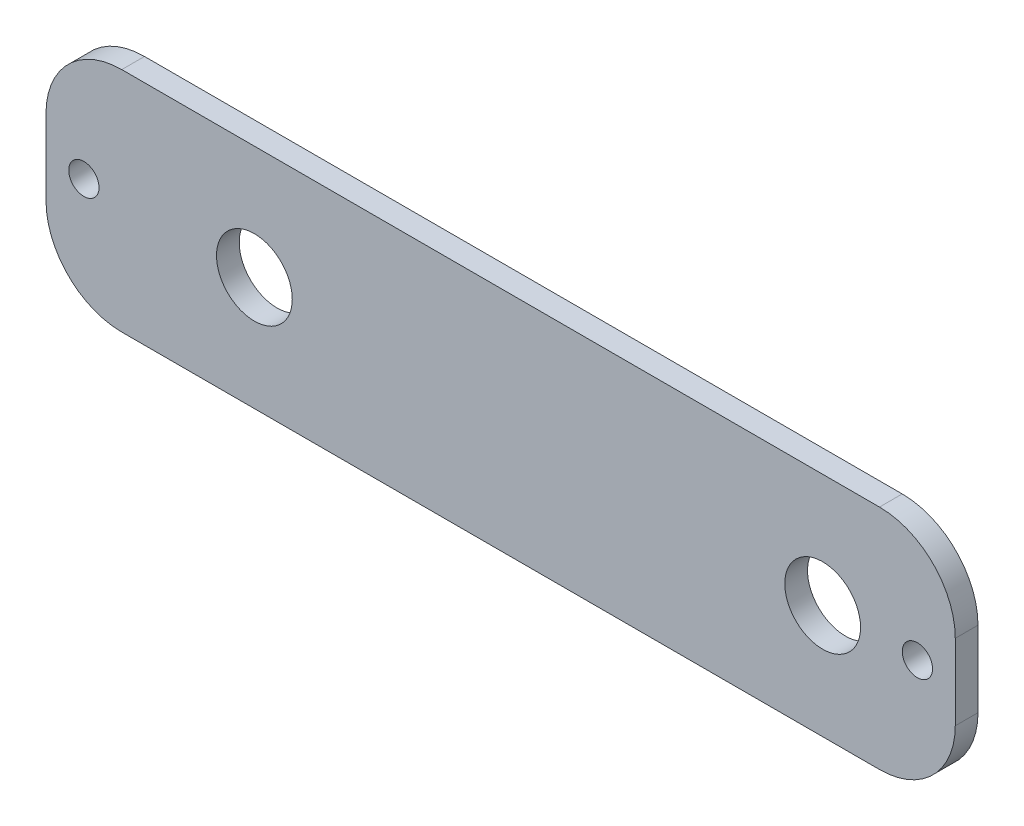
ISO-10303-21;
HEADER;
FILE_DESCRIPTION(('STEP AP214'),'2;1');
FILE_NAME('part.step','',(''),(''),'','','');
FILE_SCHEMA(('AUTOMOTIVE_DESIGN { 1 0 10303 214 1 1 1 1 }'));
ENDSEC;
DATA;
#1=APPLICATION_CONTEXT('core data for automotive mechanical design processes');
#2=APPLICATION_PROTOCOL_DEFINITION('international standard','automotive_design',2000,#1);
#3=PRODUCT_CONTEXT('',#1,'mechanical');
#4=PRODUCT('Part','Part','',(#3));
#5=PRODUCT_RELATED_PRODUCT_CATEGORY('part','',(#4));
#6=PRODUCT_DEFINITION_FORMATION('','',#4);
#7=PRODUCT_DEFINITION_CONTEXT('part definition',#1,'design');
#8=PRODUCT_DEFINITION('design','',#6,#7);
#9=PRODUCT_DEFINITION_SHAPE('','',#8);
#10=(LENGTH_UNIT() NAMED_UNIT(*) SI_UNIT(.MILLI.,.METRE.));
#11=(NAMED_UNIT(*) PLANE_ANGLE_UNIT() SI_UNIT($,.RADIAN.));
#12=(NAMED_UNIT(*) SI_UNIT($,.STERADIAN.) SOLID_ANGLE_UNIT());
#13=UNCERTAINTY_MEASURE_WITH_UNIT(LENGTH_MEASURE(1.E-05),#10,'distance_accuracy_value','');
#14=(GEOMETRIC_REPRESENTATION_CONTEXT(3) GLOBAL_UNCERTAINTY_ASSIGNED_CONTEXT((#13)) GLOBAL_UNIT_ASSIGNED_CONTEXT((#10,
#11,#12)) REPRESENTATION_CONTEXT('',''));
#15=CARTESIAN_POINT('',(0.,0.,0.));
#16=DIRECTION('',(0.,0.,1.));
#17=DIRECTION('',(1.,0.,0.));
#18=AXIS2_PLACEMENT_3D('',#15,#16,#17);
#19=CARTESIAN_POINT('',(0.,0.,3.));
#20=DIRECTION('',(0.,0.,1.));
#21=DIRECTION('',(1.,0.,0.));
#22=AXIS2_PLACEMENT_3D('',#19,#20,#21);
#23=PLANE('',#22);
#24=CARTESIAN_POINT('',(27.5,-15.,3.));
#25=DIRECTION('',(0.,0.,1.));
#26=DIRECTION('',(1.,0.,0.));
#27=AXIS2_PLACEMENT_3D('',#24,#25,#26);
#28=CIRCLE('',#27,5.);
#29=CARTESIAN_POINT('',(32.5,-15.,3.));
#30=VERTEX_POINT('',#29);
#31=EDGE_CURVE('E200',#30,#30,#28,.T.);
#32=ORIENTED_EDGE('',*,*,#31,.F.);
#33=EDGE_LOOP('',(#32));
#34=FACE_BOUND('',#33,.T.);
#35=CARTESIAN_POINT('',(102.5,-15.,3.));
#36=DIRECTION('',(0.,0.,1.));
#37=DIRECTION('',(1.,0.,0.));
#38=AXIS2_PLACEMENT_3D('',#35,#36,#37);
#39=CIRCLE('',#38,5.);
#40=CARTESIAN_POINT('',(107.5,-15.,3.));
#41=VERTEX_POINT('',#40);
#42=EDGE_CURVE('E194',#41,#41,#39,.T.);
#43=ORIENTED_EDGE('',*,*,#42,.F.);
#44=EDGE_LOOP('',(#43));
#45=FACE_BOUND('',#44,.T.);
#46=CARTESIAN_POINT('',(115.,-15.,3.));
#47=DIRECTION('',(0.,0.,1.));
#48=DIRECTION('',(1.,0.,0.));
#49=AXIS2_PLACEMENT_3D('',#46,#47,#48);
#50=CIRCLE('',#49,2.);
#51=CARTESIAN_POINT('',(117.,-15.,3.));
#52=VERTEX_POINT('',#51);
#53=EDGE_CURVE('E134',#52,#52,#50,.T.);
#54=ORIENTED_EDGE('',*,*,#53,.F.);
#55=EDGE_LOOP('',(#54));
#56=FACE_BOUND('',#55,.T.);
#57=DIRECTION('',(0.,-1.,0.));
#58=VECTOR('',#57,1.);
#59=CARTESIAN_POINT('',(0.,0.,3.));
#60=LINE('',#59,#58);
#61=CARTESIAN_POINT('',(0.,-10.,3.));
#62=VERTEX_POINT('',#61);
#63=CARTESIAN_POINT('',(0.,-20.,3.));
#64=VERTEX_POINT('',#63);
#65=EDGE_CURVE('E139',#62,#64,#60,.T.);
#66=ORIENTED_EDGE('',*,*,#65,.T.);
#67=CARTESIAN_POINT('',(10.,-20.,3.));
#68=DIRECTION('',(0.,0.,1.));
#69=DIRECTION('',(1.,0.,0.));
#70=AXIS2_PLACEMENT_3D('',#67,#68,#69);
#71=CIRCLE('',#70,10.);
#72=CARTESIAN_POINT('',(10.,-30.,3.));
#73=VERTEX_POINT('',#72);
#74=EDGE_CURVE('E153',#64,#73,#71,.T.);
#75=ORIENTED_EDGE('',*,*,#74,.T.);
#76=DIRECTION('',(1.,0.,0.));
#77=VECTOR('',#76,1.);
#78=CARTESIAN_POINT('',(0.,-30.,3.));
#79=LINE('',#78,#77);
#80=CARTESIAN_POINT('',(110.,-30.,3.));
#81=VERTEX_POINT('',#80);
#82=EDGE_CURVE('E120',#73,#81,#79,.T.);
#83=ORIENTED_EDGE('',*,*,#82,.T.);
#84=CARTESIAN_POINT('',(110.,-20.,3.));
#85=DIRECTION('',(0.,0.,1.));
#86=DIRECTION('',(1.,0.,0.));
#87=AXIS2_PLACEMENT_3D('',#84,#85,#86);
#88=CIRCLE('',#87,10.);
#89=CARTESIAN_POINT('',(120.,-20.,3.));
#90=VERTEX_POINT('',#89);
#91=EDGE_CURVE('E149',#81,#90,#88,.T.);
#92=ORIENTED_EDGE('',*,*,#91,.T.);
#93=DIRECTION('',(0.,1.,0.));
#94=VECTOR('',#93,1.);
#95=CARTESIAN_POINT('',(120.,0.,3.));
#96=LINE('',#95,#94);
#97=CARTESIAN_POINT('',(120.,-10.,3.));
#98=VERTEX_POINT('',#97);
#99=EDGE_CURVE('E162',#90,#98,#96,.T.);
#100=ORIENTED_EDGE('',*,*,#99,.T.);
#101=CARTESIAN_POINT('',(110.,-10.,3.));
#102=DIRECTION('',(0.,0.,1.));
#103=DIRECTION('',(1.,0.,0.));
#104=AXIS2_PLACEMENT_3D('',#101,#102,#103);
#105=CIRCLE('',#104,10.);
#106=CARTESIAN_POINT('',(110.,0.,3.));
#107=VERTEX_POINT('',#106);
#108=EDGE_CURVE('E55',#98,#107,#105,.T.);
#109=ORIENTED_EDGE('',*,*,#108,.T.);
#110=DIRECTION('',(-1.,0.,0.));
#111=VECTOR('',#110,1.);
#112=CARTESIAN_POINT('',(0.,0.,3.));
#113=LINE('',#112,#111);
#114=CARTESIAN_POINT('',(10.,0.,3.));
#115=VERTEX_POINT('',#114);
#116=EDGE_CURVE('E140',#107,#115,#113,.T.);
#117=ORIENTED_EDGE('',*,*,#116,.T.);
#118=CARTESIAN_POINT('',(10.,-10.,3.));
#119=DIRECTION('',(0.,0.,1.));
#120=DIRECTION('',(1.,0.,0.));
#121=AXIS2_PLACEMENT_3D('',#118,#119,#120);
#122=CIRCLE('',#121,10.);
#123=EDGE_CURVE('E151',#115,#62,#122,.T.);
#124=ORIENTED_EDGE('',*,*,#123,.T.);
#125=EDGE_LOOP('',(#66,#75,#83,#92,#100,#109,#117,#124));
#126=FACE_BOUND('',#125,.T.);
#127=CARTESIAN_POINT('',(4.99999999999999,-15.,3.));
#128=DIRECTION('',(0.,0.,1.));
#129=DIRECTION('',(1.,0.,0.));
#130=AXIS2_PLACEMENT_3D('',#127,#128,#129);
#131=CIRCLE('',#130,2.);
#132=CARTESIAN_POINT('',(6.99999999999999,-15.,3.));
#133=VERTEX_POINT('',#132);
#134=EDGE_CURVE('E185',#133,#133,#131,.T.);
#135=ORIENTED_EDGE('',*,*,#134,.F.);
#136=EDGE_LOOP('',(#135));
#137=FACE_BOUND('',#136,.T.);
#138=ADVANCED_FACE('F33',(#34,#45,#56,#126,#137),#23,.T.);
#139=CARTESIAN_POINT('',(0.,0.,0.));
#140=DIRECTION('',(0.,0.,1.));
#141=DIRECTION('',(1.,0.,0.));
#142=AXIS2_PLACEMENT_3D('',#139,#140,#141);
#143=PLANE('',#142);
#144=CARTESIAN_POINT('',(27.5,-15.,0.));
#145=DIRECTION('',(0.,0.,1.));
#146=DIRECTION('',(1.,0.,0.));
#147=AXIS2_PLACEMENT_3D('',#144,#145,#146);
#148=CIRCLE('',#147,5.);
#149=CARTESIAN_POINT('',(32.5,-15.,0.));
#150=VERTEX_POINT('',#149);
#151=EDGE_CURVE('E191',#150,#150,#148,.T.);
#152=ORIENTED_EDGE('',*,*,#151,.T.);
#153=EDGE_LOOP('',(#152));
#154=FACE_BOUND('',#153,.T.);
#155=CARTESIAN_POINT('',(102.5,-15.,0.));
#156=DIRECTION('',(0.,0.,1.));
#157=DIRECTION('',(1.,0.,0.));
#158=AXIS2_PLACEMENT_3D('',#155,#156,#157);
#159=CIRCLE('',#158,5.);
#160=CARTESIAN_POINT('',(107.5,-15.,0.));
#161=VERTEX_POINT('',#160);
#162=EDGE_CURVE('E197',#161,#161,#159,.T.);
#163=ORIENTED_EDGE('',*,*,#162,.T.);
#164=EDGE_LOOP('',(#163));
#165=FACE_BOUND('',#164,.T.);
#166=DIRECTION('',(1.,0.,0.));
#167=VECTOR('',#166,1.);
#168=CARTESIAN_POINT('',(0.,-30.,0.));
#169=LINE('',#168,#167);
#170=CARTESIAN_POINT('',(10.,-30.,0.));
#171=VERTEX_POINT('',#170);
#172=CARTESIAN_POINT('',(110.,-30.,0.));
#173=VERTEX_POINT('',#172);
#174=EDGE_CURVE('E117',#171,#173,#169,.T.);
#175=ORIENTED_EDGE('',*,*,#174,.F.);
#176=CARTESIAN_POINT('',(10.,-20.,0.));
#177=DIRECTION('',(0.,0.,1.));
#178=DIRECTION('',(1.,0.,0.));
#179=AXIS2_PLACEMENT_3D('',#176,#177,#178);
#180=CIRCLE('',#179,10.);
#181=CARTESIAN_POINT('',(0.,-20.,0.));
#182=VERTEX_POINT('',#181);
#183=EDGE_CURVE('E100',#171,#182,#180,.F.);
#184=ORIENTED_EDGE('',*,*,#183,.T.);
#185=DIRECTION('',(0.,-1.,0.));
#186=VECTOR('',#185,1.);
#187=CARTESIAN_POINT('',(0.,0.,0.));
#188=LINE('',#187,#186);
#189=CARTESIAN_POINT('',(0.,-10.,0.));
#190=VERTEX_POINT('',#189);
#191=EDGE_CURVE('E129',#190,#182,#188,.T.);
#192=ORIENTED_EDGE('',*,*,#191,.F.);
#193=CARTESIAN_POINT('',(10.,-10.,0.));
#194=DIRECTION('',(0.,0.,1.));
#195=DIRECTION('',(1.,0.,0.));
#196=AXIS2_PLACEMENT_3D('',#193,#194,#195);
#197=CIRCLE('',#196,10.);
#198=CARTESIAN_POINT('',(10.,0.,0.));
#199=VERTEX_POINT('',#198);
#200=EDGE_CURVE('E111',#190,#199,#197,.F.);
#201=ORIENTED_EDGE('',*,*,#200,.T.);
#202=DIRECTION('',(-1.,0.,0.));
#203=VECTOR('',#202,1.);
#204=CARTESIAN_POINT('',(0.,0.,0.));
#205=LINE('',#204,#203);
#206=CARTESIAN_POINT('',(110.,0.,0.));
#207=VERTEX_POINT('',#206);
#208=EDGE_CURVE('E132',#207,#199,#205,.T.);
#209=ORIENTED_EDGE('',*,*,#208,.F.);
#210=CARTESIAN_POINT('',(110.,-10.,0.));
#211=DIRECTION('',(0.,0.,1.));
#212=DIRECTION('',(1.,0.,0.));
#213=AXIS2_PLACEMENT_3D('',#210,#211,#212);
#214=CIRCLE('',#213,10.);
#215=CARTESIAN_POINT('',(120.,-10.,0.));
#216=VERTEX_POINT('',#215);
#217=EDGE_CURVE('E121',#207,#216,#214,.F.);
#218=ORIENTED_EDGE('',*,*,#217,.T.);
#219=DIRECTION('',(0.,1.,0.));
#220=VECTOR('',#219,1.);
#221=CARTESIAN_POINT('',(120.,0.,0.));
#222=LINE('',#221,#220);
#223=CARTESIAN_POINT('',(120.,-20.,0.));
#224=VERTEX_POINT('',#223);
#225=EDGE_CURVE('E128',#224,#216,#222,.T.);
#226=ORIENTED_EDGE('',*,*,#225,.F.);
#227=CARTESIAN_POINT('',(110.,-20.,0.));
#228=DIRECTION('',(0.,0.,1.));
#229=DIRECTION('',(1.,0.,0.));
#230=AXIS2_PLACEMENT_3D('',#227,#228,#229);
#231=CIRCLE('',#230,10.);
#232=EDGE_CURVE('E127',#224,#173,#231,.F.);
#233=ORIENTED_EDGE('',*,*,#232,.T.);
#234=EDGE_LOOP('',(#175,#184,#192,#201,#209,#218,#226,#233));
#235=FACE_BOUND('',#234,.T.);
#236=CARTESIAN_POINT('',(115.,-15.,0.));
#237=DIRECTION('',(0.,0.,1.));
#238=DIRECTION('',(1.,0.,0.));
#239=AXIS2_PLACEMENT_3D('',#236,#237,#238);
#240=CIRCLE('',#239,2.);
#241=CARTESIAN_POINT('',(117.,-15.,0.));
#242=VERTEX_POINT('',#241);
#243=EDGE_CURVE('E182',#242,#242,#240,.T.);
#244=ORIENTED_EDGE('',*,*,#243,.T.);
#245=EDGE_LOOP('',(#244));
#246=FACE_BOUND('',#245,.T.);
#247=CARTESIAN_POINT('',(4.99999999999999,-15.,0.));
#248=DIRECTION('',(0.,0.,1.));
#249=DIRECTION('',(1.,0.,0.));
#250=AXIS2_PLACEMENT_3D('',#247,#248,#249);
#251=CIRCLE('',#250,2.);
#252=CARTESIAN_POINT('',(6.99999999999999,-15.,0.));
#253=VERTEX_POINT('',#252);
#254=EDGE_CURVE('E188',#253,#253,#251,.T.);
#255=ORIENTED_EDGE('',*,*,#254,.T.);
#256=EDGE_LOOP('',(#255));
#257=FACE_BOUND('',#256,.T.);
#258=ADVANCED_FACE('F124',(#154,#165,#235,#246,#257),#143,.F.);
#259=CARTESIAN_POINT('',(0.,0.,3.));
#260=DIRECTION('',(1.,0.,0.));
#261=DIRECTION('',(0.,1.,0.));
#262=AXIS2_PLACEMENT_3D('',#259,#260,#261);
#263=PLANE('',#262);
#264=ORIENTED_EDGE('',*,*,#191,.T.);
#265=DIRECTION('',(0.,0.,-1.));
#266=VECTOR('',#265,1.);
#267=CARTESIAN_POINT('',(0.,-20.,3.));
#268=LINE('',#267,#266);
#269=EDGE_CURVE('E105',#182,#64,#268,.F.);
#270=ORIENTED_EDGE('',*,*,#269,.T.);
#271=ORIENTED_EDGE('',*,*,#65,.F.);
#272=DIRECTION('',(0.,0.,-1.));
#273=VECTOR('',#272,1.);
#274=CARTESIAN_POINT('',(0.,-10.,3.));
#275=LINE('',#274,#273);
#276=EDGE_CURVE('E110',#62,#190,#275,.T.);
#277=ORIENTED_EDGE('',*,*,#276,.T.);
#278=EDGE_LOOP('',(#264,#270,#271,#277));
#279=FACE_BOUND('',#278,.T.);
#280=ADVANCED_FACE('F178',(#279),#263,.F.);
#281=CARTESIAN_POINT('',(0.,-30.,3.));
#282=DIRECTION('',(0.,1.,0.));
#283=DIRECTION('',(0.,0.,1.));
#284=AXIS2_PLACEMENT_3D('',#281,#282,#283);
#285=PLANE('',#284);
#286=ORIENTED_EDGE('',*,*,#82,.F.);
#287=DIRECTION('',(0.,0.,-1.));
#288=VECTOR('',#287,1.);
#289=CARTESIAN_POINT('',(10.,-30.,3.));
#290=LINE('',#289,#288);
#291=EDGE_CURVE('E104',#73,#171,#290,.T.);
#292=ORIENTED_EDGE('',*,*,#291,.T.);
#293=ORIENTED_EDGE('',*,*,#174,.T.);
#294=DIRECTION('',(0.,0.,-1.));
#295=VECTOR('',#294,1.);
#296=CARTESIAN_POINT('',(110.,-30.,3.));
#297=LINE('',#296,#295);
#298=EDGE_CURVE('E122',#173,#81,#297,.F.);
#299=ORIENTED_EDGE('',*,*,#298,.T.);
#300=EDGE_LOOP('',(#286,#292,#293,#299));
#301=FACE_BOUND('',#300,.T.);
#302=ADVANCED_FACE('F116',(#301),#285,.F.);
#303=CARTESIAN_POINT('',(120.,0.,3.));
#304=DIRECTION('',(-1.,0.,0.));
#305=DIRECTION('',(0.,0.,1.));
#306=AXIS2_PLACEMENT_3D('',#303,#304,#305);
#307=PLANE('',#306);
#308=ORIENTED_EDGE('',*,*,#99,.F.);
#309=DIRECTION('',(0.,0.,-1.));
#310=VECTOR('',#309,1.);
#311=CARTESIAN_POINT('',(120.,-20.,3.));
#312=LINE('',#311,#310);
#313=EDGE_CURVE('E11',#90,#224,#312,.T.);
#314=ORIENTED_EDGE('',*,*,#313,.T.);
#315=ORIENTED_EDGE('',*,*,#225,.T.);
#316=DIRECTION('',(0.,0.,-1.));
#317=VECTOR('',#316,1.);
#318=CARTESIAN_POINT('',(120.,-10.,3.));
#319=LINE('',#318,#317);
#320=EDGE_CURVE('E41',#216,#98,#319,.F.);
#321=ORIENTED_EDGE('',*,*,#320,.T.);
#322=EDGE_LOOP('',(#308,#314,#315,#321));
#323=FACE_BOUND('',#322,.T.);
#324=ADVANCED_FACE('F161',(#323),#307,.F.);
#325=CARTESIAN_POINT('',(0.,0.,3.));
#326=DIRECTION('',(0.,-1.,0.));
#327=DIRECTION('',(0.,0.,-1.));
#328=AXIS2_PLACEMENT_3D('',#325,#326,#327);
#329=PLANE('',#328);
#330=ORIENTED_EDGE('',*,*,#208,.T.);
#331=DIRECTION('',(0.,0.,-1.));
#332=VECTOR('',#331,1.);
#333=CARTESIAN_POINT('',(10.,0.,3.));
#334=LINE('',#333,#332);
#335=EDGE_CURVE('E48',#199,#115,#334,.F.);
#336=ORIENTED_EDGE('',*,*,#335,.T.);
#337=ORIENTED_EDGE('',*,*,#116,.F.);
#338=DIRECTION('',(0.,0.,-1.));
#339=VECTOR('',#338,1.);
#340=CARTESIAN_POINT('',(110.,0.,3.));
#341=LINE('',#340,#339);
#342=EDGE_CURVE('E155',#107,#207,#341,.T.);
#343=ORIENTED_EDGE('',*,*,#342,.T.);
#344=EDGE_LOOP('',(#330,#336,#337,#343));
#345=FACE_BOUND('',#344,.T.);
#346=ADVANCED_FACE('F171',(#345),#329,.F.);
#347=CARTESIAN_POINT('',(115.,-15.,3.));
#348=DIRECTION('',(0.,0.,-1.));
#349=DIRECTION('',(-1.,0.,0.));
#350=AXIS2_PLACEMENT_3D('',#347,#348,#349);
#351=CYLINDRICAL_SURFACE('',#350,2.);
#352=ORIENTED_EDGE('',*,*,#53,.T.);
#353=EDGE_LOOP('',(#352));
#354=FACE_BOUND('',#353,.T.);
#355=ORIENTED_EDGE('',*,*,#243,.F.);
#356=EDGE_LOOP('',(#355));
#357=FACE_BOUND('',#356,.T.);
#358=ADVANCED_FACE('F222',(#354,#357),#351,.F.);
#359=CARTESIAN_POINT('',(4.99999999999999,-15.,3.));
#360=DIRECTION('',(0.,0.,-1.));
#361=DIRECTION('',(-1.,0.,0.));
#362=AXIS2_PLACEMENT_3D('',#359,#360,#361);
#363=CYLINDRICAL_SURFACE('',#362,2.);
#364=ORIENTED_EDGE('',*,*,#134,.T.);
#365=EDGE_LOOP('',(#364));
#366=FACE_BOUND('',#365,.T.);
#367=ORIENTED_EDGE('',*,*,#254,.F.);
#368=EDGE_LOOP('',(#367));
#369=FACE_BOUND('',#368,.T.);
#370=ADVANCED_FACE('F225',(#366,#369),#363,.F.);
#371=CARTESIAN_POINT('',(10.,-20.,3.));
#372=DIRECTION('',(0.,0.,-1.));
#373=DIRECTION('',(-1.,0.,0.));
#374=AXIS2_PLACEMENT_3D('',#371,#372,#373);
#375=CYLINDRICAL_SURFACE('',#374,10.);
#376=ORIENTED_EDGE('',*,*,#74,.F.);
#377=ORIENTED_EDGE('',*,*,#269,.F.);
#378=ORIENTED_EDGE('',*,*,#183,.F.);
#379=ORIENTED_EDGE('',*,*,#291,.F.);
#380=EDGE_LOOP('',(#376,#377,#378,#379));
#381=FACE_BOUND('',#380,.T.);
#382=ADVANCED_FACE('F103',(#381),#375,.T.);
#383=CARTESIAN_POINT('',(10.,-10.,3.));
#384=DIRECTION('',(0.,0.,-1.));
#385=DIRECTION('',(-1.,0.,0.));
#386=AXIS2_PLACEMENT_3D('',#383,#384,#385);
#387=CYLINDRICAL_SURFACE('',#386,10.);
#388=ORIENTED_EDGE('',*,*,#123,.F.);
#389=ORIENTED_EDGE('',*,*,#335,.F.);
#390=ORIENTED_EDGE('',*,*,#200,.F.);
#391=ORIENTED_EDGE('',*,*,#276,.F.);
#392=EDGE_LOOP('',(#388,#389,#390,#391));
#393=FACE_BOUND('',#392,.T.);
#394=ADVANCED_FACE('F175',(#393),#387,.T.);
#395=CARTESIAN_POINT('',(110.,-20.,3.));
#396=DIRECTION('',(0.,0.,-1.));
#397=DIRECTION('',(-1.,0.,0.));
#398=AXIS2_PLACEMENT_3D('',#395,#396,#397);
#399=CYLINDRICAL_SURFACE('',#398,10.);
#400=ORIENTED_EDGE('',*,*,#91,.F.);
#401=ORIENTED_EDGE('',*,*,#298,.F.);
#402=ORIENTED_EDGE('',*,*,#232,.F.);
#403=ORIENTED_EDGE('',*,*,#313,.F.);
#404=EDGE_LOOP('',(#400,#401,#402,#403));
#405=FACE_BOUND('',#404,.T.);
#406=ADVANCED_FACE('F251',(#405),#399,.T.);
#407=CARTESIAN_POINT('',(110.,-10.,3.));
#408=DIRECTION('',(0.,0.,-1.));
#409=DIRECTION('',(-1.,0.,0.));
#410=AXIS2_PLACEMENT_3D('',#407,#408,#409);
#411=CYLINDRICAL_SURFACE('',#410,10.);
#412=ORIENTED_EDGE('',*,*,#108,.F.);
#413=ORIENTED_EDGE('',*,*,#320,.F.);
#414=ORIENTED_EDGE('',*,*,#217,.F.);
#415=ORIENTED_EDGE('',*,*,#342,.F.);
#416=EDGE_LOOP('',(#412,#413,#414,#415));
#417=FACE_BOUND('',#416,.T.);
#418=ADVANCED_FACE('F35',(#417),#411,.T.);
#419=CARTESIAN_POINT('',(102.5,-15.,0.));
#420=DIRECTION('',(0.,0.,1.));
#421=DIRECTION('',(1.,0.,0.));
#422=AXIS2_PLACEMENT_3D('',#419,#420,#421);
#423=CYLINDRICAL_SURFACE('',#422,5.);
#424=ORIENTED_EDGE('',*,*,#162,.F.);
#425=EDGE_LOOP('',(#424));
#426=FACE_BOUND('',#425,.T.);
#427=ORIENTED_EDGE('',*,*,#42,.T.);
#428=EDGE_LOOP('',(#427));
#429=FACE_BOUND('',#428,.T.);
#430=ADVANCED_FACE('F211',(#426,#429),#423,.F.);
#431=CARTESIAN_POINT('',(27.5,-15.,0.));
#432=DIRECTION('',(0.,0.,1.));
#433=DIRECTION('',(1.,0.,0.));
#434=AXIS2_PLACEMENT_3D('',#431,#432,#433);
#435=CYLINDRICAL_SURFACE('',#434,5.);
#436=ORIENTED_EDGE('',*,*,#151,.F.);
#437=EDGE_LOOP('',(#436));
#438=FACE_BOUND('',#437,.T.);
#439=ORIENTED_EDGE('',*,*,#31,.T.);
#440=EDGE_LOOP('',(#439));
#441=FACE_BOUND('',#440,.T.);
#442=ADVANCED_FACE('F208',(#438,#441),#435,.F.);
#443=CLOSED_SHELL('',(#138,#258,#280,#302,#324,#346,#358,#370,#382,#394,#406,#418,#430,#442));
#444=MANIFOLD_SOLID_BREP('B2',#443);
#445=ADVANCED_BREP_SHAPE_REPRESENTATION('',(#18,#444),#14);
#446=SHAPE_DEFINITION_REPRESENTATION(#9,#445);
ENDSEC;
END-ISO-10303-21;
